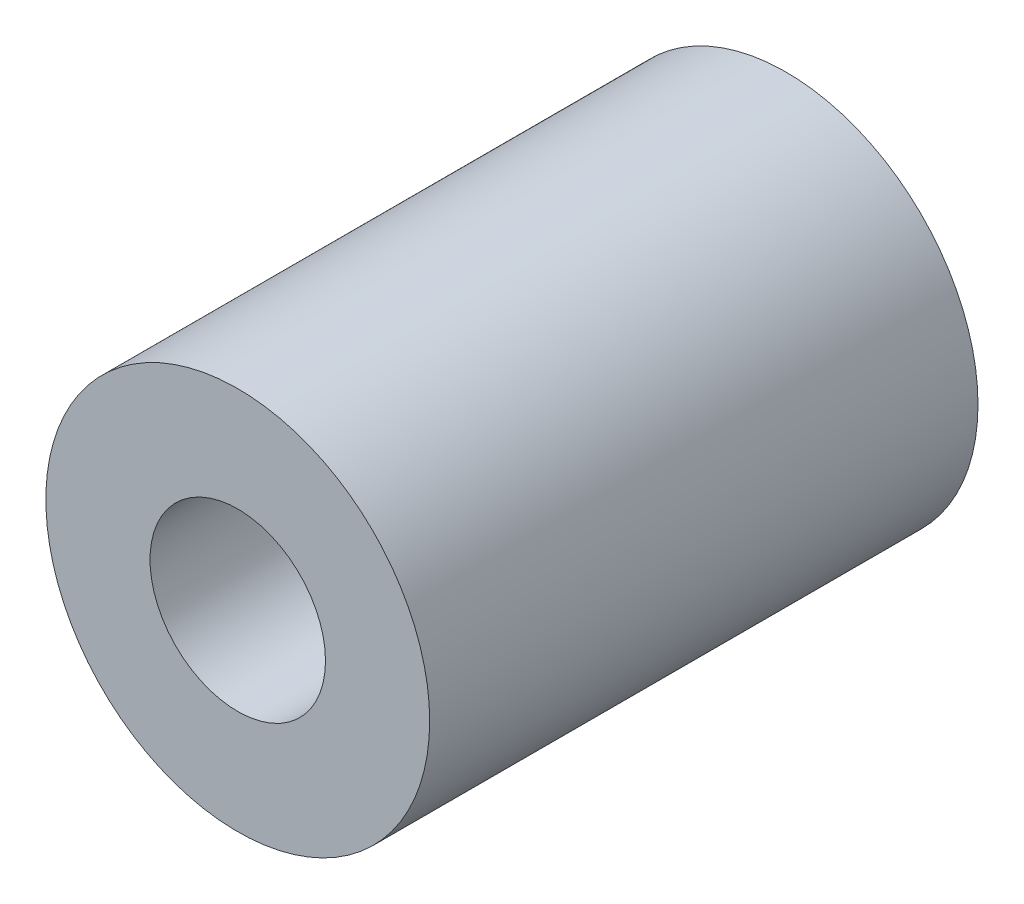
ISO-10303-21;
HEADER;
FILE_DESCRIPTION(('STEP AP214'),'2;1');
FILE_NAME('part.step','',(''),(''),'','','');
FILE_SCHEMA(('AUTOMOTIVE_DESIGN { 1 0 10303 214 1 1 1 1 }'));
ENDSEC;
DATA;
#1=APPLICATION_CONTEXT('core data for automotive mechanical design processes');
#2=APPLICATION_PROTOCOL_DEFINITION('international standard','automotive_design',2000,#1);
#3=PRODUCT_CONTEXT('',#1,'mechanical');
#4=PRODUCT('Part','Part','',(#3));
#5=PRODUCT_RELATED_PRODUCT_CATEGORY('part','',(#4));
#6=PRODUCT_DEFINITION_FORMATION('','',#4);
#7=PRODUCT_DEFINITION_CONTEXT('part definition',#1,'design');
#8=PRODUCT_DEFINITION('design','',#6,#7);
#9=PRODUCT_DEFINITION_SHAPE('','',#8);
#10=(LENGTH_UNIT() NAMED_UNIT(*) SI_UNIT(.MILLI.,.METRE.));
#11=(NAMED_UNIT(*) PLANE_ANGLE_UNIT() SI_UNIT($,.RADIAN.));
#12=(NAMED_UNIT(*) SI_UNIT($,.STERADIAN.) SOLID_ANGLE_UNIT());
#13=UNCERTAINTY_MEASURE_WITH_UNIT(LENGTH_MEASURE(1.E-05),#10,'distance_accuracy_value','');
#14=(GEOMETRIC_REPRESENTATION_CONTEXT(3) GLOBAL_UNCERTAINTY_ASSIGNED_CONTEXT((#13)) GLOBAL_UNIT_ASSIGNED_CONTEXT((#10,
#11,#12)) REPRESENTATION_CONTEXT('',''));
#15=CARTESIAN_POINT('',(0.,0.,0.));
#16=DIRECTION('',(0.,0.,1.));
#17=DIRECTION('',(1.,0.,0.));
#18=AXIS2_PLACEMENT_3D('',#15,#16,#17);
#19=CARTESIAN_POINT('',(0.,0.,10.));
#20=DIRECTION('',(0.,0.,1.));
#21=DIRECTION('',(1.,0.,0.));
#22=AXIS2_PLACEMENT_3D('',#19,#20,#21);
#23=PLANE('',#22);
#24=CARTESIAN_POINT('',(0.,0.,10.));
#25=DIRECTION('',(0.,0.,1.));
#26=DIRECTION('',(1.,0.,0.));
#27=AXIS2_PLACEMENT_3D('',#24,#25,#26);
#28=CIRCLE('',#27,3.5);
#29=CARTESIAN_POINT('',(3.5,0.,10.));
#30=VERTEX_POINT('',#29);
#31=EDGE_CURVE('E10',#30,#30,#28,.T.);
#32=ORIENTED_EDGE('',*,*,#31,.T.);
#33=EDGE_LOOP('',(#32));
#34=FACE_BOUND('',#33,.T.);
#35=CARTESIAN_POINT('',(0.,0.,10.));
#36=DIRECTION('',(0.,0.,1.));
#37=DIRECTION('',(1.,0.,0.));
#38=AXIS2_PLACEMENT_3D('',#35,#36,#37);
#39=CIRCLE('',#38,1.6);
#40=CARTESIAN_POINT('',(1.6,0.,10.));
#41=VERTEX_POINT('',#40);
#42=EDGE_CURVE('E46',#41,#41,#39,.T.);
#43=ORIENTED_EDGE('',*,*,#42,.F.);
#44=EDGE_LOOP('',(#43));
#45=FACE_BOUND('',#44,.T.);
#46=ADVANCED_FACE('F35',(#34,#45),#23,.T.);
#47=CARTESIAN_POINT('',(0.,0.,0.));
#48=DIRECTION('',(0.,0.,1.));
#49=DIRECTION('',(1.,0.,0.));
#50=AXIS2_PLACEMENT_3D('',#47,#48,#49);
#51=PLANE('',#50);
#52=CARTESIAN_POINT('',(0.,0.,0.));
#53=DIRECTION('',(0.,0.,1.));
#54=DIRECTION('',(1.,0.,0.));
#55=AXIS2_PLACEMENT_3D('',#52,#53,#54);
#56=CIRCLE('',#55,3.5);
#57=CARTESIAN_POINT('',(3.5,0.,0.));
#58=VERTEX_POINT('',#57);
#59=EDGE_CURVE('E39',#58,#58,#56,.T.);
#60=ORIENTED_EDGE('',*,*,#59,.F.);
#61=EDGE_LOOP('',(#60));
#62=FACE_BOUND('',#61,.T.);
#63=CARTESIAN_POINT('',(0.,0.,0.));
#64=DIRECTION('',(0.,0.,1.));
#65=DIRECTION('',(1.,0.,0.));
#66=AXIS2_PLACEMENT_3D('',#63,#64,#65);
#67=CIRCLE('',#66,1.6);
#68=CARTESIAN_POINT('',(1.6,0.,0.));
#69=VERTEX_POINT('',#68);
#70=EDGE_CURVE('E48',#69,#69,#67,.T.);
#71=ORIENTED_EDGE('',*,*,#70,.T.);
#72=EDGE_LOOP('',(#71));
#73=FACE_BOUND('',#72,.T.);
#74=ADVANCED_FACE('F58',(#62,#73),#51,.F.);
#75=CARTESIAN_POINT('',(0.,0.,10.));
#76=DIRECTION('',(0.,0.,-1.));
#77=DIRECTION('',(-1.,0.,0.));
#78=AXIS2_PLACEMENT_3D('',#75,#76,#77);
#79=CYLINDRICAL_SURFACE('',#78,3.5);
#80=ORIENTED_EDGE('',*,*,#31,.F.);
#81=EDGE_LOOP('',(#80));
#82=FACE_BOUND('',#81,.T.);
#83=ORIENTED_EDGE('',*,*,#59,.T.);
#84=EDGE_LOOP('',(#83));
#85=FACE_BOUND('',#84,.T.);
#86=ADVANCED_FACE('F37',(#82,#85),#79,.T.);
#87=CARTESIAN_POINT('',(0.,0.,10.));
#88=DIRECTION('',(0.,0.,-1.));
#89=DIRECTION('',(-1.,0.,0.));
#90=AXIS2_PLACEMENT_3D('',#87,#88,#89);
#91=CYLINDRICAL_SURFACE('',#90,1.6);
#92=ORIENTED_EDGE('',*,*,#42,.T.);
#93=EDGE_LOOP('',(#92));
#94=FACE_BOUND('',#93,.T.);
#95=ORIENTED_EDGE('',*,*,#70,.F.);
#96=EDGE_LOOP('',(#95));
#97=FACE_BOUND('',#96,.T.);
#98=ADVANCED_FACE('F54',(#94,#97),#91,.F.);
#99=CLOSED_SHELL('',(#46,#74,#86,#98));
#100=MANIFOLD_SOLID_BREP('B2',#99);
#101=ADVANCED_BREP_SHAPE_REPRESENTATION('',(#18,#100),#14);
#102=SHAPE_DEFINITION_REPRESENTATION(#9,#101);
ENDSEC;
END-ISO-10303-21;
